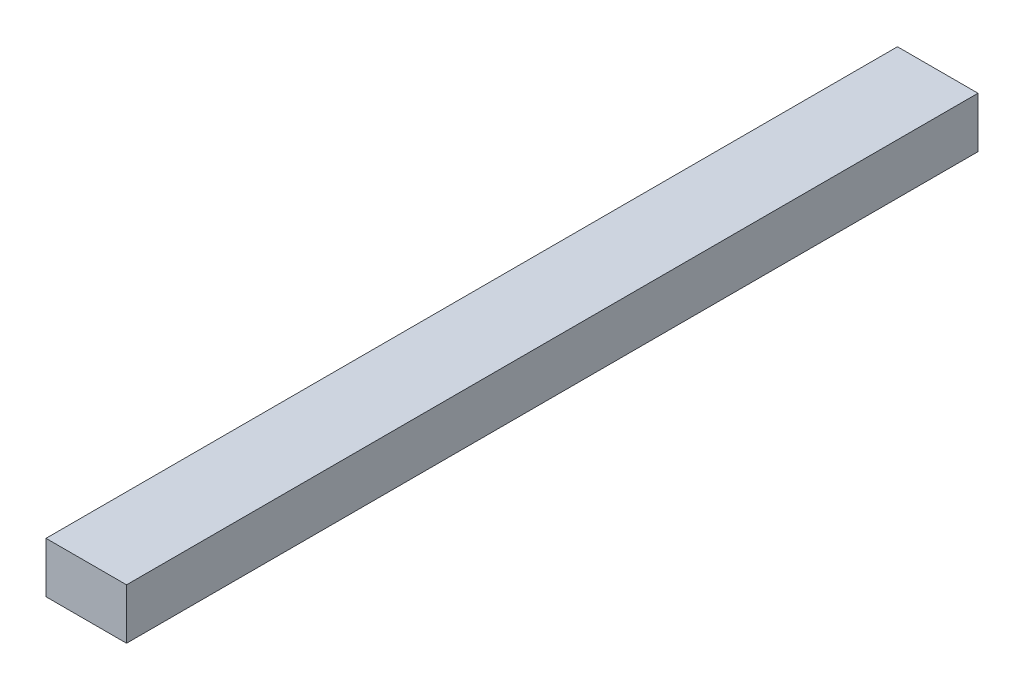
ISO-10303-21;
HEADER;
FILE_DESCRIPTION(('STEP AP214'),'2;1');
FILE_NAME('part.step','',(''),(''),'','','');
FILE_SCHEMA(('AUTOMOTIVE_DESIGN { 1 0 10303 214 1 1 1 1 }'));
ENDSEC;
DATA;
#1=APPLICATION_CONTEXT('core data for automotive mechanical design processes');
#2=APPLICATION_PROTOCOL_DEFINITION('international standard','automotive_design',2000,#1);
#3=PRODUCT_CONTEXT('',#1,'mechanical');
#4=PRODUCT('Part','Part','',(#3));
#5=PRODUCT_RELATED_PRODUCT_CATEGORY('part','',(#4));
#6=PRODUCT_DEFINITION_FORMATION('','',#4);
#7=PRODUCT_DEFINITION_CONTEXT('part definition',#1,'design');
#8=PRODUCT_DEFINITION('design','',#6,#7);
#9=PRODUCT_DEFINITION_SHAPE('','',#8);
#10=(LENGTH_UNIT() NAMED_UNIT(*) SI_UNIT(.MILLI.,.METRE.));
#11=(NAMED_UNIT(*) PLANE_ANGLE_UNIT() SI_UNIT($,.RADIAN.));
#12=(NAMED_UNIT(*) SI_UNIT($,.STERADIAN.) SOLID_ANGLE_UNIT());
#13=UNCERTAINTY_MEASURE_WITH_UNIT(LENGTH_MEASURE(1.E-05),#10,'distance_accuracy_value','');
#14=(GEOMETRIC_REPRESENTATION_CONTEXT(3) GLOBAL_UNCERTAINTY_ASSIGNED_CONTEXT((#13)) GLOBAL_UNIT_ASSIGNED_CONTEXT((#10,
#11,#12)) REPRESENTATION_CONTEXT('',''));
#15=CARTESIAN_POINT('',(0.,0.,0.));
#16=DIRECTION('',(0.,0.,1.));
#17=DIRECTION('',(1.,0.,0.));
#18=AXIS2_PLACEMENT_3D('',#15,#16,#17);
#19=CARTESIAN_POINT('',(-35.,-22.,672.680106434377));
#20=DIRECTION('',(0.,1.,0.));
#21=DIRECTION('',(0.,0.,1.));
#22=AXIS2_PLACEMENT_3D('',#19,#20,#21);
#23=PLANE('',#22);
#24=DIRECTION('',(0.,0.,-1.));
#25=VECTOR('',#24,1.);
#26=CARTESIAN_POINT('',(35.,-22.,672.680106434377));
#27=LINE('',#26,#25);
#28=CARTESIAN_POINT('',(35.,-22.,590.));
#29=VERTEX_POINT('',#28);
#30=CARTESIAN_POINT('',(35.,-22.,-150.));
#31=VERTEX_POINT('',#30);
#32=EDGE_CURVE('E92',#29,#31,#27,.T.);
#33=ORIENTED_EDGE('',*,*,#32,.F.);
#34=DIRECTION('',(-1.,0.,0.));
#35=VECTOR('',#34,1.);
#36=CARTESIAN_POINT('',(-35.,-22.,590.));
#37=LINE('',#36,#35);
#38=CARTESIAN_POINT('',(-35.,-22.,590.));
#39=VERTEX_POINT('',#38);
#40=EDGE_CURVE('E35',#29,#39,#37,.T.);
#41=ORIENTED_EDGE('',*,*,#40,.T.);
#42=DIRECTION('',(0.,0.,-1.));
#43=VECTOR('',#42,1.);
#44=CARTESIAN_POINT('',(-35.,-22.,672.680106434377));
#45=LINE('',#44,#43);
#46=CARTESIAN_POINT('',(-35.,-22.,-150.));
#47=VERTEX_POINT('',#46);
#48=EDGE_CURVE('E79',#39,#47,#45,.T.);
#49=ORIENTED_EDGE('',*,*,#48,.T.);
#50=DIRECTION('',(-1.,0.,0.));
#51=VECTOR('',#50,1.);
#52=CARTESIAN_POINT('',(-35.,-22.,-150.));
#53=LINE('',#52,#51);
#54=EDGE_CURVE('E89',#31,#47,#53,.T.);
#55=ORIENTED_EDGE('',*,*,#54,.F.);
#56=EDGE_LOOP('',(#33,#41,#49,#55));
#57=FACE_BOUND('',#56,.T.);
#58=ADVANCED_FACE('F31',(#57),#23,.F.);
#59=CARTESIAN_POINT('',(-35.,-22.,672.680106434377));
#60=DIRECTION('',(1.,0.,0.));
#61=DIRECTION('',(0.,0.,-1.));
#62=AXIS2_PLACEMENT_3D('',#59,#60,#61);
#63=PLANE('',#62);
#64=ORIENTED_EDGE('',*,*,#48,.F.);
#65=DIRECTION('',(0.,1.,0.));
#66=VECTOR('',#65,1.);
#67=CARTESIAN_POINT('',(-35.,-22.,590.));
#68=LINE('',#67,#66);
#69=CARTESIAN_POINT('',(-35.,22.,590.));
#70=VERTEX_POINT('',#69);
#71=EDGE_CURVE('E75',#39,#70,#68,.T.);
#72=ORIENTED_EDGE('',*,*,#71,.T.);
#73=DIRECTION('',(0.,0.,-1.));
#74=VECTOR('',#73,1.);
#75=CARTESIAN_POINT('',(-35.,22.,672.680106434377));
#76=LINE('',#75,#74);
#77=CARTESIAN_POINT('',(-35.,22.,-150.));
#78=VERTEX_POINT('',#77);
#79=EDGE_CURVE('E70',#70,#78,#76,.T.);
#80=ORIENTED_EDGE('',*,*,#79,.T.);
#81=DIRECTION('',(0.,1.,0.));
#82=VECTOR('',#81,1.);
#83=CARTESIAN_POINT('',(-35.,-22.0000000000001,-150.));
#84=LINE('',#83,#82);
#85=EDGE_CURVE('E74',#47,#78,#84,.T.);
#86=ORIENTED_EDGE('',*,*,#85,.F.);
#87=EDGE_LOOP('',(#64,#72,#80,#86));
#88=FACE_BOUND('',#87,.T.);
#89=ADVANCED_FACE('F73',(#88),#63,.F.);
#90=CARTESIAN_POINT('',(-35.,22.,672.680106434377));
#91=DIRECTION('',(0.,-1.,0.));
#92=DIRECTION('',(0.,0.,-1.));
#93=AXIS2_PLACEMENT_3D('',#90,#91,#92);
#94=PLANE('',#93);
#95=ORIENTED_EDGE('',*,*,#79,.F.);
#96=DIRECTION('',(1.,0.,0.));
#97=VECTOR('',#96,1.);
#98=CARTESIAN_POINT('',(-35.,22.,590.));
#99=LINE('',#98,#97);
#100=CARTESIAN_POINT('',(35.,22.,590.));
#101=VERTEX_POINT('',#100);
#102=EDGE_CURVE('E40',#70,#101,#99,.T.);
#103=ORIENTED_EDGE('',*,*,#102,.T.);
#104=DIRECTION('',(0.,0.,-1.));
#105=VECTOR('',#104,1.);
#106=CARTESIAN_POINT('',(35.,22.,672.680106434377));
#107=LINE('',#106,#105);
#108=CARTESIAN_POINT('',(35.,22.,-150.));
#109=VERTEX_POINT('',#108);
#110=EDGE_CURVE('E78',#101,#109,#107,.T.);
#111=ORIENTED_EDGE('',*,*,#110,.T.);
#112=DIRECTION('',(1.,0.,0.));
#113=VECTOR('',#112,1.);
#114=CARTESIAN_POINT('',(-35.,22.,-150.));
#115=LINE('',#114,#113);
#116=EDGE_CURVE('E86',#78,#109,#115,.T.);
#117=ORIENTED_EDGE('',*,*,#116,.F.);
#118=EDGE_LOOP('',(#95,#103,#111,#117));
#119=FACE_BOUND('',#118,.T.);
#120=ADVANCED_FACE('F91',(#119),#94,.F.);
#121=CARTESIAN_POINT('',(35.,-22.,672.680106434377));
#122=DIRECTION('',(-1.,0.,0.));
#123=DIRECTION('',(0.,0.,1.));
#124=AXIS2_PLACEMENT_3D('',#121,#122,#123);
#125=PLANE('',#124);
#126=ORIENTED_EDGE('',*,*,#110,.F.);
#127=DIRECTION('',(0.,-1.,0.));
#128=VECTOR('',#127,1.);
#129=CARTESIAN_POINT('',(35.,-22.,590.));
#130=LINE('',#129,#128);
#131=EDGE_CURVE('E11',#101,#29,#130,.T.);
#132=ORIENTED_EDGE('',*,*,#131,.T.);
#133=ORIENTED_EDGE('',*,*,#32,.T.);
#134=DIRECTION('',(0.,-1.,0.));
#135=VECTOR('',#134,1.);
#136=CARTESIAN_POINT('',(35.,-22.0000000000001,-150.));
#137=LINE('',#136,#135);
#138=EDGE_CURVE('E93',#109,#31,#137,.T.);
#139=ORIENTED_EDGE('',*,*,#138,.F.);
#140=EDGE_LOOP('',(#126,#132,#133,#139));
#141=FACE_BOUND('',#140,.T.);
#142=ADVANCED_FACE('F33',(#141),#125,.F.);
#143=CARTESIAN_POINT('',(495.,65.9999999999999,590.));
#144=DIRECTION('',(0.,0.,-1.));
#145=DIRECTION('',(0.,1.,0.));
#146=AXIS2_PLACEMENT_3D('',#143,#144,#145);
#147=PLANE('',#146);
#148=ORIENTED_EDGE('',*,*,#102,.F.);
#149=ORIENTED_EDGE('',*,*,#71,.F.);
#150=ORIENTED_EDGE('',*,*,#40,.F.);
#151=ORIENTED_EDGE('',*,*,#131,.F.);
#152=EDGE_LOOP('',(#148,#149,#150,#151));
#153=FACE_BOUND('',#152,.T.);
#154=ADVANCED_FACE('F104',(#153),#147,.F.);
#155=CARTESIAN_POINT('',(495.,22.0000000000001,-150.));
#156=DIRECTION('',(0.,0.,1.));
#157=DIRECTION('',(0.,-1.,0.));
#158=AXIS2_PLACEMENT_3D('',#155,#156,#157);
#159=PLANE('',#158);
#160=ORIENTED_EDGE('',*,*,#138,.T.);
#161=ORIENTED_EDGE('',*,*,#54,.T.);
#162=ORIENTED_EDGE('',*,*,#85,.T.);
#163=ORIENTED_EDGE('',*,*,#116,.T.);
#164=EDGE_LOOP('',(#160,#161,#162,#163));
#165=FACE_BOUND('',#164,.T.);
#166=ADVANCED_FACE('F85',(#165),#159,.F.);
#167=CLOSED_SHELL('',(#58,#89,#120,#142,#154,#166));
#168=MANIFOLD_SOLID_BREP('B2',#167);
#169=ADVANCED_BREP_SHAPE_REPRESENTATION('',(#18,#168),#14);
#170=SHAPE_DEFINITION_REPRESENTATION(#9,#169);
ENDSEC;
END-ISO-10303-21;
